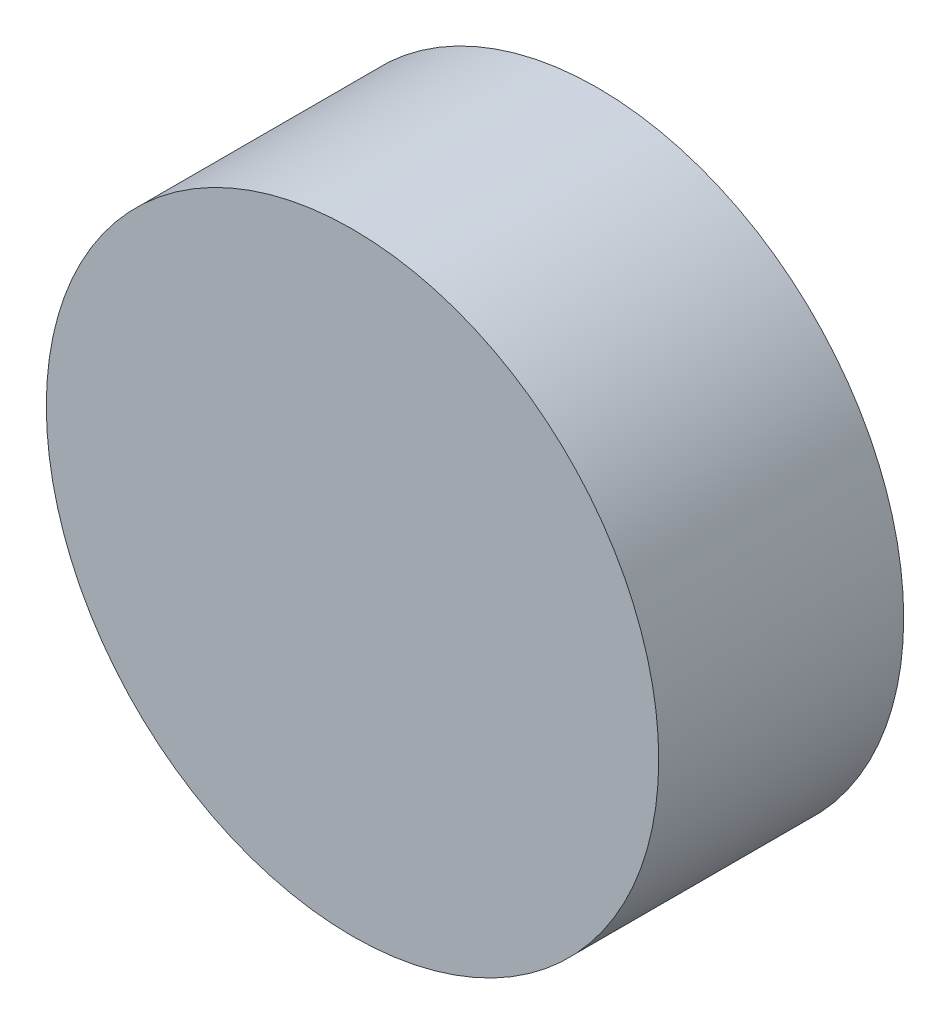
ISO-10303-21;
HEADER;
FILE_DESCRIPTION(('STEP AP214'),'2;1');
FILE_NAME('part.step','',(''),(''),'','','');
FILE_SCHEMA(('AUTOMOTIVE_DESIGN { 1 0 10303 214 1 1 1 1 }'));
ENDSEC;
DATA;
#1=APPLICATION_CONTEXT('core data for automotive mechanical design processes');
#2=APPLICATION_PROTOCOL_DEFINITION('international standard','automotive_design',2000,#1);
#3=PRODUCT_CONTEXT('',#1,'mechanical');
#4=PRODUCT('Part','Part','',(#3));
#5=PRODUCT_RELATED_PRODUCT_CATEGORY('part','',(#4));
#6=PRODUCT_DEFINITION_FORMATION('','',#4);
#7=PRODUCT_DEFINITION_CONTEXT('part definition',#1,'design');
#8=PRODUCT_DEFINITION('design','',#6,#7);
#9=PRODUCT_DEFINITION_SHAPE('','',#8);
#10=(LENGTH_UNIT() NAMED_UNIT(*) SI_UNIT(.MILLI.,.METRE.));
#11=(NAMED_UNIT(*) PLANE_ANGLE_UNIT() SI_UNIT($,.RADIAN.));
#12=(NAMED_UNIT(*) SI_UNIT($,.STERADIAN.) SOLID_ANGLE_UNIT());
#13=UNCERTAINTY_MEASURE_WITH_UNIT(LENGTH_MEASURE(1.E-05),#10,'distance_accuracy_value','');
#14=(GEOMETRIC_REPRESENTATION_CONTEXT(3) GLOBAL_UNCERTAINTY_ASSIGNED_CONTEXT((#13)) GLOBAL_UNIT_ASSIGNED_CONTEXT((#10,
#11,#12)) REPRESENTATION_CONTEXT('',''));
#15=CARTESIAN_POINT('',(0.,0.,0.));
#16=DIRECTION('',(0.,0.,1.));
#17=DIRECTION('',(1.,0.,0.));
#18=AXIS2_PLACEMENT_3D('',#15,#16,#17);
#19=CARTESIAN_POINT('',(0.,68.,-720.));
#20=DIRECTION('',(0.,0.,1.));
#21=DIRECTION('',(1.,0.,0.));
#22=AXIS2_PLACEMENT_3D('',#19,#20,#21);
#23=CYLINDRICAL_SURFACE('',#22,25.);
#24=CARTESIAN_POINT('',(0.,68.,-720.));
#25=DIRECTION('',(0.,0.,1.));
#26=DIRECTION('',(1.,0.,0.));
#27=AXIS2_PLACEMENT_3D('',#24,#25,#26);
#28=CIRCLE('',#27,25.);
#29=CARTESIAN_POINT('',(25.,68.,-720.));
#30=VERTEX_POINT('',#29);
#31=EDGE_CURVE('E10',#30,#30,#28,.T.);
#32=ORIENTED_EDGE('',*,*,#31,.T.);
#33=EDGE_LOOP('',(#32));
#34=FACE_BOUND('',#33,.T.);
#35=CARTESIAN_POINT('',(0.,68.,-700.));
#36=DIRECTION('',(0.,0.,1.));
#37=DIRECTION('',(1.,0.,0.));
#38=AXIS2_PLACEMENT_3D('',#35,#36,#37);
#39=CIRCLE('',#38,25.);
#40=CARTESIAN_POINT('',(25.,68.,-700.));
#41=VERTEX_POINT('',#40);
#42=EDGE_CURVE('E40',#41,#41,#39,.T.);
#43=ORIENTED_EDGE('',*,*,#42,.F.);
#44=EDGE_LOOP('',(#43));
#45=FACE_BOUND('',#44,.T.);
#46=ADVANCED_FACE('F37',(#34,#45),#23,.T.);
#47=CARTESIAN_POINT('',(0.,68.,-720.));
#48=DIRECTION('',(0.,0.,1.));
#49=DIRECTION('',(1.,0.,0.));
#50=AXIS2_PLACEMENT_3D('',#47,#48,#49);
#51=PLANE('',#50);
#52=ORIENTED_EDGE('',*,*,#31,.F.);
#53=EDGE_LOOP('',(#52));
#54=FACE_BOUND('',#53,.T.);
#55=ADVANCED_FACE('F52',(#54),#51,.F.);
#56=CARTESIAN_POINT('',(0.,68.,-700.));
#57=DIRECTION('',(0.,0.,1.));
#58=DIRECTION('',(1.,0.,0.));
#59=AXIS2_PLACEMENT_3D('',#56,#57,#58);
#60=PLANE('',#59);
#61=ORIENTED_EDGE('',*,*,#42,.T.);
#62=EDGE_LOOP('',(#61));
#63=FACE_BOUND('',#62,.T.);
#64=ADVANCED_FACE('F49',(#63),#60,.T.);
#65=CLOSED_SHELL('',(#46,#55,#64));
#66=MANIFOLD_SOLID_BREP('B2',#65);
#67=ADVANCED_BREP_SHAPE_REPRESENTATION('',(#18,#66),#14);
#68=SHAPE_DEFINITION_REPRESENTATION(#9,#67);
ENDSEC;
END-ISO-10303-21;
